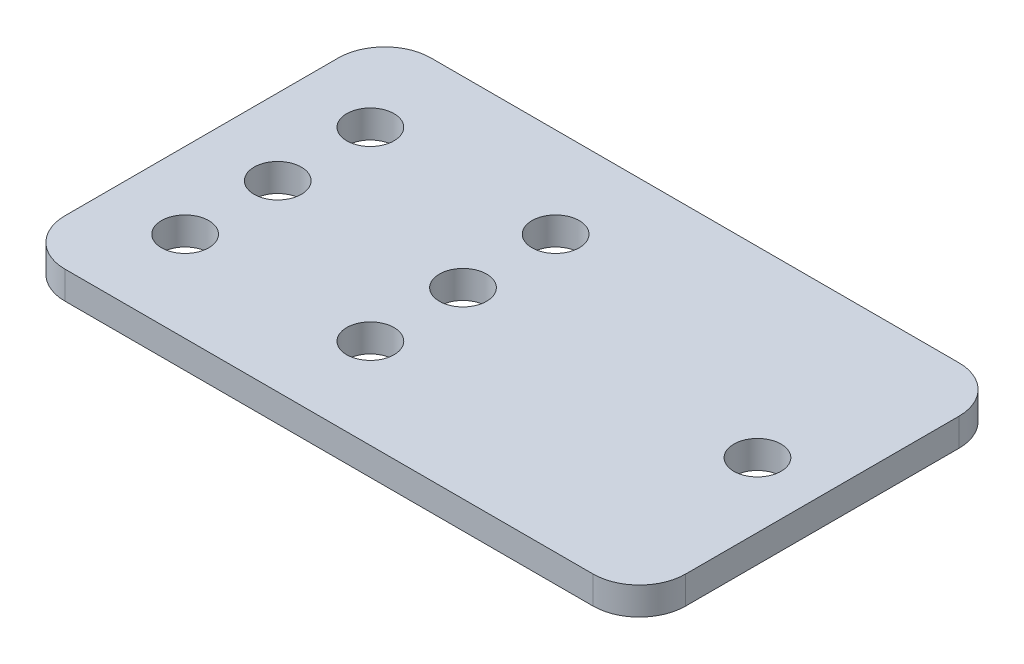
ISO-10303-21;
HEADER;
FILE_DESCRIPTION(('STEP AP214'),'2;1');
FILE_NAME('part.step','',(''),(''),'','','');
FILE_SCHEMA(('AUTOMOTIVE_DESIGN { 1 0 10303 214 1 1 1 1 }'));
ENDSEC;
DATA;
#1=APPLICATION_CONTEXT('core data for automotive mechanical design processes');
#2=APPLICATION_PROTOCOL_DEFINITION('international standard','automotive_design',2000,#1);
#3=PRODUCT_CONTEXT('',#1,'mechanical');
#4=PRODUCT('Part','Part','',(#3));
#5=PRODUCT_RELATED_PRODUCT_CATEGORY('part','',(#4));
#6=PRODUCT_DEFINITION_FORMATION('','',#4);
#7=PRODUCT_DEFINITION_CONTEXT('part definition',#1,'design');
#8=PRODUCT_DEFINITION('design','',#6,#7);
#9=PRODUCT_DEFINITION_SHAPE('','',#8);
#10=(LENGTH_UNIT() NAMED_UNIT(*) SI_UNIT(.MILLI.,.METRE.));
#11=(NAMED_UNIT(*) PLANE_ANGLE_UNIT() SI_UNIT($,.RADIAN.));
#12=(NAMED_UNIT(*) SI_UNIT($,.STERADIAN.) SOLID_ANGLE_UNIT());
#13=UNCERTAINTY_MEASURE_WITH_UNIT(LENGTH_MEASURE(1.E-05),#10,'distance_accuracy_value','');
#14=(GEOMETRIC_REPRESENTATION_CONTEXT(3) GLOBAL_UNCERTAINTY_ASSIGNED_CONTEXT((#13)) GLOBAL_UNIT_ASSIGNED_CONTEXT((#10,
#11,#12)) REPRESENTATION_CONTEXT('',''));
#15=CARTESIAN_POINT('',(0.,0.,0.));
#16=DIRECTION('',(0.,0.,1.));
#17=DIRECTION('',(1.,0.,0.));
#18=AXIS2_PLACEMENT_3D('',#15,#16,#17);
#19=CARTESIAN_POINT('',(-5.,3.,-34.5));
#20=DIRECTION('',(0.,-1.,0.));
#21=DIRECTION('',(0.,0.,-1.));
#22=AXIS2_PLACEMENT_3D('',#19,#20,#21);
#23=PLANE('',#22);
#24=DIRECTION('',(0.,0.,-1.));
#25=VECTOR('',#24,1.);
#26=CARTESIAN_POINT('',(0.,3.,-5.00000000000004));
#27=LINE('',#26,#25);
#28=CARTESIAN_POINT('',(0.,3.,-5.00000000000003));
#29=VERTEX_POINT('',#28);
#30=CARTESIAN_POINT('',(0.,3.,-34.5));
#31=VERTEX_POINT('',#30);
#32=EDGE_CURVE('E283',#29,#31,#27,.T.);
#33=ORIENTED_EDGE('',*,*,#32,.T.);
#34=CARTESIAN_POINT('',(-5.,3.,-34.5));
#35=DIRECTION('',(0.,-1.,0.));
#36=DIRECTION('',(0.,0.,-1.));
#37=AXIS2_PLACEMENT_3D('',#34,#35,#36);
#38=CIRCLE('',#37,5.);
#39=CARTESIAN_POINT('',(-5.00000000000003,3.,-39.5));
#40=VERTEX_POINT('',#39);
#41=EDGE_CURVE('E366',#40,#31,#38,.T.);
#42=ORIENTED_EDGE('',*,*,#41,.F.);
#43=DIRECTION('',(-1.,0.,0.));
#44=VECTOR('',#43,1.);
#45=CARTESIAN_POINT('',(-5.00000000000004,3.,-39.5));
#46=LINE('',#45,#44);
#47=CARTESIAN_POINT('',(-62.,3.,-39.5));
#48=VERTEX_POINT('',#47);
#49=EDGE_CURVE('E356',#40,#48,#46,.T.);
#50=ORIENTED_EDGE('',*,*,#49,.T.);
#51=CARTESIAN_POINT('',(-62.,3.,-34.5));
#52=DIRECTION('',(0.,-1.,0.));
#53=DIRECTION('',(0.,0.,-1.));
#54=AXIS2_PLACEMENT_3D('',#51,#52,#53);
#55=CIRCLE('',#54,5.);
#56=CARTESIAN_POINT('',(-67.,3.,-34.5));
#57=VERTEX_POINT('',#56);
#58=EDGE_CURVE('E374',#57,#48,#55,.T.);
#59=ORIENTED_EDGE('',*,*,#58,.F.);
#60=DIRECTION('',(0.,0.,-1.));
#61=VECTOR('',#60,1.);
#62=CARTESIAN_POINT('',(-67.,3.,-5.00000000000003));
#63=LINE('',#62,#61);
#64=CARTESIAN_POINT('',(-67.,3.,-5.00000000000003));
#65=VERTEX_POINT('',#64);
#66=EDGE_CURVE('E306',#65,#57,#63,.T.);
#67=ORIENTED_EDGE('',*,*,#66,.F.);
#68=CARTESIAN_POINT('',(-62.,3.,-4.99999999999999));
#69=DIRECTION('',(0.,1.,0.));
#70=DIRECTION('',(0.,0.,1.));
#71=AXIS2_PLACEMENT_3D('',#68,#69,#70);
#72=CIRCLE('',#71,5.);
#73=CARTESIAN_POINT('',(-62.,3.,0.));
#74=VERTEX_POINT('',#73);
#75=EDGE_CURVE('E299',#65,#74,#72,.T.);
#76=ORIENTED_EDGE('',*,*,#75,.T.);
#77=DIRECTION('',(-1.,0.,0.));
#78=VECTOR('',#77,1.);
#79=CARTESIAN_POINT('',(-5.00000000000004,3.,0.));
#80=LINE('',#79,#78);
#81=CARTESIAN_POINT('',(-5.00000000000004,3.,0.));
#82=VERTEX_POINT('',#81);
#83=EDGE_CURVE('E303',#82,#74,#80,.T.);
#84=ORIENTED_EDGE('',*,*,#83,.F.);
#85=CARTESIAN_POINT('',(-5.,3.,-5.));
#86=DIRECTION('',(0.,1.,0.));
#87=DIRECTION('',(0.,0.,1.));
#88=AXIS2_PLACEMENT_3D('',#85,#86,#87);
#89=CIRCLE('',#88,5.);
#90=EDGE_CURVE('E247',#82,#29,#89,.T.);
#91=ORIENTED_EDGE('',*,*,#90,.T.);
#92=EDGE_LOOP('',(#33,#42,#50,#59,#67,#76,#84,#91));
#93=FACE_BOUND('',#92,.T.);
#94=CARTESIAN_POINT('',(-38.79,3.,-9.74999999999999));
#95=DIRECTION('',(0.,1.,0.));
#96=DIRECTION('',(0.,0.,1.));
#97=AXIS2_PLACEMENT_3D('',#94,#95,#96);
#98=CIRCLE('',#97,2.55);
#99=CARTESIAN_POINT('',(-38.79,3.,-7.2));
#100=VERTEX_POINT('',#99);
#101=EDGE_CURVE('E329',#100,#100,#98,.T.);
#102=ORIENTED_EDGE('',*,*,#101,.F.);
#103=EDGE_LOOP('',(#102));
#104=FACE_BOUND('',#103,.T.);
#105=CARTESIAN_POINT('',(-38.79,3.,-19.75));
#106=DIRECTION('',(0.,1.,0.));
#107=DIRECTION('',(0.,0.,1.));
#108=AXIS2_PLACEMENT_3D('',#105,#106,#107);
#109=CIRCLE('',#108,2.55);
#110=CARTESIAN_POINT('',(-38.79,3.,-17.2));
#111=VERTEX_POINT('',#110);
#112=EDGE_CURVE('E383',#111,#111,#109,.T.);
#113=ORIENTED_EDGE('',*,*,#112,.F.);
#114=EDGE_LOOP('',(#113));
#115=FACE_BOUND('',#114,.T.);
#116=CARTESIAN_POINT('',(-58.79,3.,-9.74999999999999));
#117=DIRECTION('',(0.,1.,0.));
#118=DIRECTION('',(0.,0.,1.));
#119=AXIS2_PLACEMENT_3D('',#116,#117,#118);
#120=CIRCLE('',#119,2.55);
#121=CARTESIAN_POINT('',(-58.79,3.,-7.2));
#122=VERTEX_POINT('',#121);
#123=EDGE_CURVE('E389',#122,#122,#120,.T.);
#124=ORIENTED_EDGE('',*,*,#123,.F.);
#125=EDGE_LOOP('',(#124));
#126=FACE_BOUND('',#125,.T.);
#127=CARTESIAN_POINT('',(-58.79,3.,-19.75));
#128=DIRECTION('',(0.,1.,0.));
#129=DIRECTION('',(0.,0.,1.));
#130=AXIS2_PLACEMENT_3D('',#127,#128,#129);
#131=CIRCLE('',#130,2.55);
#132=CARTESIAN_POINT('',(-58.79,3.,-17.2));
#133=VERTEX_POINT('',#132);
#134=EDGE_CURVE('E395',#133,#133,#131,.T.);
#135=ORIENTED_EDGE('',*,*,#134,.F.);
#136=EDGE_LOOP('',(#135));
#137=FACE_BOUND('',#136,.T.);
#138=CARTESIAN_POINT('',(-58.79,3.,-29.75));
#139=DIRECTION('',(0.,1.,0.));
#140=DIRECTION('',(0.,0.,1.));
#141=AXIS2_PLACEMENT_3D('',#138,#139,#140);
#142=CIRCLE('',#141,2.55);
#143=CARTESIAN_POINT('',(-58.79,3.,-27.2));
#144=VERTEX_POINT('',#143);
#145=EDGE_CURVE('E401',#144,#144,#142,.T.);
#146=ORIENTED_EDGE('',*,*,#145,.F.);
#147=EDGE_LOOP('',(#146));
#148=FACE_BOUND('',#147,.T.);
#149=CARTESIAN_POINT('',(-38.79,3.,-29.75));
#150=DIRECTION('',(0.,1.,0.));
#151=DIRECTION('',(0.,0.,1.));
#152=AXIS2_PLACEMENT_3D('',#149,#150,#151);
#153=CIRCLE('',#152,2.55);
#154=CARTESIAN_POINT('',(-38.79,3.,-27.2));
#155=VERTEX_POINT('',#154);
#156=EDGE_CURVE('E407',#155,#155,#153,.T.);
#157=ORIENTED_EDGE('',*,*,#156,.F.);
#158=EDGE_LOOP('',(#157));
#159=FACE_BOUND('',#158,.T.);
#160=CARTESIAN_POINT('',(-7.00000000000001,3.,-19.75));
#161=DIRECTION('',(0.,1.,0.));
#162=DIRECTION('',(0.,0.,1.));
#163=AXIS2_PLACEMENT_3D('',#160,#161,#162);
#164=CIRCLE('',#163,2.55);
#165=CARTESIAN_POINT('',(-7.00000000000001,3.,-17.2));
#166=VERTEX_POINT('',#165);
#167=EDGE_CURVE('E413',#166,#166,#164,.T.);
#168=ORIENTED_EDGE('',*,*,#167,.F.);
#169=EDGE_LOOP('',(#168));
#170=FACE_BOUND('',#169,.T.);
#171=ADVANCED_FACE('F230',(#93,#104,#115,#126,#137,#148,#159,#170),#23,.F.);
#172=CARTESIAN_POINT('',(-5.,0.,-34.5));
#173=DIRECTION('',(0.,-1.,0.));
#174=DIRECTION('',(0.,0.,-1.));
#175=AXIS2_PLACEMENT_3D('',#172,#173,#174);
#176=PLANE('',#175);
#177=CARTESIAN_POINT('',(-38.79,0.,-29.75));
#178=DIRECTION('',(0.,1.,0.));
#179=DIRECTION('',(0.,0.,1.));
#180=AXIS2_PLACEMENT_3D('',#177,#178,#179);
#181=CIRCLE('',#180,2.55);
#182=CARTESIAN_POINT('',(-38.79,0.,-27.2));
#183=VERTEX_POINT('',#182);
#184=EDGE_CURVE('E410',#183,#183,#181,.T.);
#185=ORIENTED_EDGE('',*,*,#184,.T.);
#186=EDGE_LOOP('',(#185));
#187=FACE_BOUND('',#186,.T.);
#188=CARTESIAN_POINT('',(-58.79,0.,-19.75));
#189=DIRECTION('',(0.,1.,0.));
#190=DIRECTION('',(0.,0.,1.));
#191=AXIS2_PLACEMENT_3D('',#188,#189,#190);
#192=CIRCLE('',#191,2.55);
#193=CARTESIAN_POINT('',(-58.79,0.,-17.2));
#194=VERTEX_POINT('',#193);
#195=EDGE_CURVE('E398',#194,#194,#192,.T.);
#196=ORIENTED_EDGE('',*,*,#195,.T.);
#197=EDGE_LOOP('',(#196));
#198=FACE_BOUND('',#197,.T.);
#199=CARTESIAN_POINT('',(-38.79,0.,-19.75));
#200=DIRECTION('',(0.,1.,0.));
#201=DIRECTION('',(0.,0.,1.));
#202=AXIS2_PLACEMENT_3D('',#199,#200,#201);
#203=CIRCLE('',#202,2.55);
#204=CARTESIAN_POINT('',(-38.79,0.,-17.2));
#205=VERTEX_POINT('',#204);
#206=EDGE_CURVE('E386',#205,#205,#203,.T.);
#207=ORIENTED_EDGE('',*,*,#206,.T.);
#208=EDGE_LOOP('',(#207));
#209=FACE_BOUND('',#208,.T.);
#210=DIRECTION('',(0.,0.,-1.));
#211=VECTOR('',#210,1.);
#212=CARTESIAN_POINT('',(0.,0.,-5.00000000000004));
#213=LINE('',#212,#211);
#214=CARTESIAN_POINT('',(0.,0.,-5.00000000000003));
#215=VERTEX_POINT('',#214);
#216=CARTESIAN_POINT('',(0.,0.,-34.5));
#217=VERTEX_POINT('',#216);
#218=EDGE_CURVE('E325',#215,#217,#213,.T.);
#219=ORIENTED_EDGE('',*,*,#218,.F.);
#220=CARTESIAN_POINT('',(-5.,0.,-5.));
#221=DIRECTION('',(0.,1.,0.));
#222=DIRECTION('',(0.,0.,1.));
#223=AXIS2_PLACEMENT_3D('',#220,#221,#222);
#224=CIRCLE('',#223,5.);
#225=CARTESIAN_POINT('',(-5.00000000000004,0.,0.));
#226=VERTEX_POINT('',#225);
#227=EDGE_CURVE('E277',#226,#215,#224,.T.);
#228=ORIENTED_EDGE('',*,*,#227,.F.);
#229=DIRECTION('',(-1.,0.,0.));
#230=VECTOR('',#229,1.);
#231=CARTESIAN_POINT('',(-5.00000000000004,0.,0.));
#232=LINE('',#231,#230);
#233=CARTESIAN_POINT('',(-62.,0.,0.));
#234=VERTEX_POINT('',#233);
#235=EDGE_CURVE('E342',#226,#234,#232,.T.);
#236=ORIENTED_EDGE('',*,*,#235,.T.);
#237=CARTESIAN_POINT('',(-62.,0.,-4.99999999999999));
#238=DIRECTION('',(0.,1.,0.));
#239=DIRECTION('',(0.,0.,1.));
#240=AXIS2_PLACEMENT_3D('',#237,#238,#239);
#241=CIRCLE('',#240,5.);
#242=CARTESIAN_POINT('',(-67.,0.,-5.00000000000003));
#243=VERTEX_POINT('',#242);
#244=EDGE_CURVE('E313',#243,#234,#241,.T.);
#245=ORIENTED_EDGE('',*,*,#244,.F.);
#246=DIRECTION('',(0.,0.,-1.));
#247=VECTOR('',#246,1.);
#248=CARTESIAN_POINT('',(-67.,0.,-5.00000000000003));
#249=LINE('',#248,#247);
#250=CARTESIAN_POINT('',(-67.,0.,-34.5));
#251=VERTEX_POINT('',#250);
#252=EDGE_CURVE('E338',#243,#251,#249,.T.);
#253=ORIENTED_EDGE('',*,*,#252,.T.);
#254=CARTESIAN_POINT('',(-62.,0.,-34.5));
#255=DIRECTION('',(0.,-1.,0.));
#256=DIRECTION('',(0.,0.,-1.));
#257=AXIS2_PLACEMENT_3D('',#254,#255,#256);
#258=CIRCLE('',#257,5.);
#259=CARTESIAN_POINT('',(-62.,0.,-39.5));
#260=VERTEX_POINT('',#259);
#261=EDGE_CURVE('E335',#251,#260,#258,.T.);
#262=ORIENTED_EDGE('',*,*,#261,.T.);
#263=DIRECTION('',(-1.,0.,0.));
#264=VECTOR('',#263,1.);
#265=CARTESIAN_POINT('',(-5.00000000000004,0.,-39.5));
#266=LINE('',#265,#264);
#267=CARTESIAN_POINT('',(-5.00000000000003,0.,-39.5));
#268=VERTEX_POINT('',#267);
#269=EDGE_CURVE('E332',#268,#260,#266,.T.);
#270=ORIENTED_EDGE('',*,*,#269,.F.);
#271=CARTESIAN_POINT('',(-5.,0.,-34.5));
#272=DIRECTION('',(0.,-1.,0.));
#273=DIRECTION('',(0.,0.,-1.));
#274=AXIS2_PLACEMENT_3D('',#271,#272,#273);
#275=CIRCLE('',#274,5.);
#276=EDGE_CURVE('E328',#268,#217,#275,.T.);
#277=ORIENTED_EDGE('',*,*,#276,.T.);
#278=EDGE_LOOP('',(#219,#228,#236,#245,#253,#262,#270,#277));
#279=FACE_BOUND('',#278,.T.);
#280=CARTESIAN_POINT('',(-38.79,0.,-9.74999999999999));
#281=DIRECTION('',(0.,1.,0.));
#282=DIRECTION('',(0.,0.,1.));
#283=AXIS2_PLACEMENT_3D('',#280,#281,#282);
#284=CIRCLE('',#283,2.55);
#285=CARTESIAN_POINT('',(-38.79,0.,-7.2));
#286=VERTEX_POINT('',#285);
#287=EDGE_CURVE('E380',#286,#286,#284,.T.);
#288=ORIENTED_EDGE('',*,*,#287,.T.);
#289=EDGE_LOOP('',(#288));
#290=FACE_BOUND('',#289,.T.);
#291=CARTESIAN_POINT('',(-58.79,0.,-9.74999999999999));
#292=DIRECTION('',(0.,1.,0.));
#293=DIRECTION('',(0.,0.,1.));
#294=AXIS2_PLACEMENT_3D('',#291,#292,#293);
#295=CIRCLE('',#294,2.55);
#296=CARTESIAN_POINT('',(-58.79,0.,-7.2));
#297=VERTEX_POINT('',#296);
#298=EDGE_CURVE('E392',#297,#297,#295,.T.);
#299=ORIENTED_EDGE('',*,*,#298,.T.);
#300=EDGE_LOOP('',(#299));
#301=FACE_BOUND('',#300,.T.);
#302=CARTESIAN_POINT('',(-58.79,0.,-29.75));
#303=DIRECTION('',(0.,1.,0.));
#304=DIRECTION('',(0.,0.,1.));
#305=AXIS2_PLACEMENT_3D('',#302,#303,#304);
#306=CIRCLE('',#305,2.55);
#307=CARTESIAN_POINT('',(-58.79,0.,-27.2));
#308=VERTEX_POINT('',#307);
#309=EDGE_CURVE('E404',#308,#308,#306,.T.);
#310=ORIENTED_EDGE('',*,*,#309,.T.);
#311=EDGE_LOOP('',(#310));
#312=FACE_BOUND('',#311,.T.);
#313=CARTESIAN_POINT('',(-7.00000000000001,0.,-19.75));
#314=DIRECTION('',(0.,1.,0.));
#315=DIRECTION('',(0.,0.,1.));
#316=AXIS2_PLACEMENT_3D('',#313,#314,#315);
#317=CIRCLE('',#316,2.55);
#318=CARTESIAN_POINT('',(-7.00000000000001,0.,-17.2));
#319=VERTEX_POINT('',#318);
#320=EDGE_CURVE('E416',#319,#319,#317,.T.);
#321=ORIENTED_EDGE('',*,*,#320,.T.);
#322=EDGE_LOOP('',(#321));
#323=FACE_BOUND('',#322,.T.);
#324=ADVANCED_FACE('F362',(#187,#198,#209,#279,#290,#301,#312,#323),#176,.T.);
#325=CARTESIAN_POINT('',(0.,3.,-5.00000000000004));
#326=DIRECTION('',(-1.,0.,0.));
#327=DIRECTION('',(0.,0.,1.));
#328=AXIS2_PLACEMENT_3D('',#325,#326,#327);
#329=PLANE('',#328);
#330=ORIENTED_EDGE('',*,*,#218,.T.);
#331=DIRECTION('',(0.,-1.,0.));
#332=VECTOR('',#331,1.);
#333=CARTESIAN_POINT('',(0.,3.,-34.5));
#334=LINE('',#333,#332);
#335=EDGE_CURVE('E12',#31,#217,#334,.T.);
#336=ORIENTED_EDGE('',*,*,#335,.F.);
#337=ORIENTED_EDGE('',*,*,#32,.F.);
#338=DIRECTION('',(0.,-1.,0.));
#339=VECTOR('',#338,1.);
#340=CARTESIAN_POINT('',(0.,3.,-5.00000000000003));
#341=LINE('',#340,#339);
#342=EDGE_CURVE('E321',#29,#215,#341,.T.);
#343=ORIENTED_EDGE('',*,*,#342,.T.);
#344=EDGE_LOOP('',(#330,#336,#337,#343));
#345=FACE_BOUND('',#344,.T.);
#346=ADVANCED_FACE('F232',(#345),#329,.F.);
#347=CARTESIAN_POINT('',(-5.,3.,-34.5));
#348=DIRECTION('',(0.,-1.,0.));
#349=DIRECTION('',(0.,0.,-1.));
#350=AXIS2_PLACEMENT_3D('',#347,#348,#349);
#351=CYLINDRICAL_SURFACE('',#350,5.);
#352=ORIENTED_EDGE('',*,*,#276,.F.);
#353=DIRECTION('',(0.,-1.,0.));
#354=VECTOR('',#353,1.);
#355=CARTESIAN_POINT('',(-5.00000000000003,3.,-39.5));
#356=LINE('',#355,#354);
#357=EDGE_CURVE('E239',#40,#268,#356,.T.);
#358=ORIENTED_EDGE('',*,*,#357,.F.);
#359=ORIENTED_EDGE('',*,*,#41,.T.);
#360=ORIENTED_EDGE('',*,*,#335,.T.);
#361=EDGE_LOOP('',(#352,#358,#359,#360));
#362=FACE_BOUND('',#361,.T.);
#363=ADVANCED_FACE('F365',(#362),#351,.T.);
#364=CARTESIAN_POINT('',(-5.00000000000004,3.,-39.5));
#365=DIRECTION('',(0.,0.,1.));
#366=DIRECTION('',(1.,0.,0.));
#367=AXIS2_PLACEMENT_3D('',#364,#365,#366);
#368=PLANE('',#367);
#369=ORIENTED_EDGE('',*,*,#269,.T.);
#370=DIRECTION('',(0.,-1.,0.));
#371=VECTOR('',#370,1.);
#372=CARTESIAN_POINT('',(-62.,3.,-39.5));
#373=LINE('',#372,#371);
#374=EDGE_CURVE('E350',#48,#260,#373,.T.);
#375=ORIENTED_EDGE('',*,*,#374,.F.);
#376=ORIENTED_EDGE('',*,*,#49,.F.);
#377=ORIENTED_EDGE('',*,*,#357,.T.);
#378=EDGE_LOOP('',(#369,#375,#376,#377));
#379=FACE_BOUND('',#378,.T.);
#380=ADVANCED_FACE('F354',(#379),#368,.F.);
#381=CARTESIAN_POINT('',(-62.,3.,-34.5));
#382=DIRECTION('',(0.,-1.,0.));
#383=DIRECTION('',(0.,0.,-1.));
#384=AXIS2_PLACEMENT_3D('',#381,#382,#383);
#385=CYLINDRICAL_SURFACE('',#384,5.);
#386=ORIENTED_EDGE('',*,*,#261,.F.);
#387=DIRECTION('',(0.,-1.,0.));
#388=VECTOR('',#387,1.);
#389=CARTESIAN_POINT('',(-67.,3.,-34.5));
#390=LINE('',#389,#388);
#391=EDGE_CURVE('E348',#57,#251,#390,.T.);
#392=ORIENTED_EDGE('',*,*,#391,.F.);
#393=ORIENTED_EDGE('',*,*,#58,.T.);
#394=ORIENTED_EDGE('',*,*,#374,.T.);
#395=EDGE_LOOP('',(#386,#392,#393,#394));
#396=FACE_BOUND('',#395,.T.);
#397=ADVANCED_FACE('F373',(#396),#385,.T.);
#398=CARTESIAN_POINT('',(-67.,3.,-5.00000000000003));
#399=DIRECTION('',(-1.,0.,0.));
#400=DIRECTION('',(0.,0.,1.));
#401=AXIS2_PLACEMENT_3D('',#398,#399,#400);
#402=PLANE('',#401);
#403=ORIENTED_EDGE('',*,*,#252,.F.);
#404=DIRECTION('',(0.,-1.,0.));
#405=VECTOR('',#404,1.);
#406=CARTESIAN_POINT('',(-67.,3.,-5.00000000000003));
#407=LINE('',#406,#405);
#408=EDGE_CURVE('E317',#65,#243,#407,.T.);
#409=ORIENTED_EDGE('',*,*,#408,.F.);
#410=ORIENTED_EDGE('',*,*,#66,.T.);
#411=ORIENTED_EDGE('',*,*,#391,.T.);
#412=EDGE_LOOP('',(#403,#409,#410,#411));
#413=FACE_BOUND('',#412,.T.);
#414=ADVANCED_FACE('F370',(#413),#402,.T.);
#415=CARTESIAN_POINT('',(-62.,3.,-4.99999999999999));
#416=DIRECTION('',(0.,-1.,0.));
#417=DIRECTION('',(0.,0.,-1.));
#418=AXIS2_PLACEMENT_3D('',#415,#416,#417);
#419=CYLINDRICAL_SURFACE('',#418,5.);
#420=ORIENTED_EDGE('',*,*,#244,.T.);
#421=DIRECTION('',(0.,-1.,0.));
#422=VECTOR('',#421,1.);
#423=CARTESIAN_POINT('',(-62.,3.,0.));
#424=LINE('',#423,#422);
#425=EDGE_CURVE('E310',#74,#234,#424,.T.);
#426=ORIENTED_EDGE('',*,*,#425,.F.);
#427=ORIENTED_EDGE('',*,*,#75,.F.);
#428=ORIENTED_EDGE('',*,*,#408,.T.);
#429=EDGE_LOOP('',(#420,#426,#427,#428));
#430=FACE_BOUND('',#429,.T.);
#431=ADVANCED_FACE('F311',(#430),#419,.T.);
#432=CARTESIAN_POINT('',(-5.00000000000004,3.,0.));
#433=DIRECTION('',(0.,0.,1.));
#434=DIRECTION('',(1.,0.,0.));
#435=AXIS2_PLACEMENT_3D('',#432,#433,#434);
#436=PLANE('',#435);
#437=ORIENTED_EDGE('',*,*,#235,.F.);
#438=DIRECTION('',(0.,-1.,0.));
#439=VECTOR('',#438,1.);
#440=CARTESIAN_POINT('',(-5.00000000000004,3.,0.));
#441=LINE('',#440,#439);
#442=EDGE_CURVE('E274',#82,#226,#441,.T.);
#443=ORIENTED_EDGE('',*,*,#442,.F.);
#444=ORIENTED_EDGE('',*,*,#83,.T.);
#445=ORIENTED_EDGE('',*,*,#425,.T.);
#446=EDGE_LOOP('',(#437,#443,#444,#445));
#447=FACE_BOUND('',#446,.T.);
#448=ADVANCED_FACE('F319',(#447),#436,.T.);
#449=CARTESIAN_POINT('',(-5.,3.,-5.));
#450=DIRECTION('',(0.,-1.,0.));
#451=DIRECTION('',(0.,0.,-1.));
#452=AXIS2_PLACEMENT_3D('',#449,#450,#451);
#453=CYLINDRICAL_SURFACE('',#452,5.);
#454=ORIENTED_EDGE('',*,*,#227,.T.);
#455=ORIENTED_EDGE('',*,*,#342,.F.);
#456=ORIENTED_EDGE('',*,*,#90,.F.);
#457=ORIENTED_EDGE('',*,*,#442,.T.);
#458=EDGE_LOOP('',(#454,#455,#456,#457));
#459=FACE_BOUND('',#458,.T.);
#460=ADVANCED_FACE('F436',(#459),#453,.T.);
#461=CARTESIAN_POINT('',(-38.79,3.,-9.74999999999999));
#462=DIRECTION('',(0.,-1.,0.));
#463=DIRECTION('',(0.,0.,-1.));
#464=AXIS2_PLACEMENT_3D('',#461,#462,#463);
#465=CYLINDRICAL_SURFACE('',#464,2.55);
#466=ORIENTED_EDGE('',*,*,#101,.T.);
#467=EDGE_LOOP('',(#466));
#468=FACE_BOUND('',#467,.T.);
#469=ORIENTED_EDGE('',*,*,#287,.F.);
#470=EDGE_LOOP('',(#469));
#471=FACE_BOUND('',#470,.T.);
#472=ADVANCED_FACE('F433',(#468,#471),#465,.F.);
#473=CARTESIAN_POINT('',(-38.79,3.,-19.75));
#474=DIRECTION('',(0.,-1.,0.));
#475=DIRECTION('',(0.,0.,-1.));
#476=AXIS2_PLACEMENT_3D('',#473,#474,#475);
#477=CYLINDRICAL_SURFACE('',#476,2.55);
#478=ORIENTED_EDGE('',*,*,#112,.T.);
#479=EDGE_LOOP('',(#478));
#480=FACE_BOUND('',#479,.T.);
#481=ORIENTED_EDGE('',*,*,#206,.F.);
#482=EDGE_LOOP('',(#481));
#483=FACE_BOUND('',#482,.T.);
#484=ADVANCED_FACE('F519',(#480,#483),#477,.F.);
#485=CARTESIAN_POINT('',(-58.79,3.,-9.74999999999999));
#486=DIRECTION('',(0.,-1.,0.));
#487=DIRECTION('',(0.,0.,-1.));
#488=AXIS2_PLACEMENT_3D('',#485,#486,#487);
#489=CYLINDRICAL_SURFACE('',#488,2.55);
#490=ORIENTED_EDGE('',*,*,#123,.T.);
#491=EDGE_LOOP('',(#490));
#492=FACE_BOUND('',#491,.T.);
#493=ORIENTED_EDGE('',*,*,#298,.F.);
#494=EDGE_LOOP('',(#493));
#495=FACE_BOUND('',#494,.T.);
#496=ADVANCED_FACE('F527',(#492,#495),#489,.F.);
#497=CARTESIAN_POINT('',(-58.79,3.,-19.75));
#498=DIRECTION('',(0.,-1.,0.));
#499=DIRECTION('',(0.,0.,-1.));
#500=AXIS2_PLACEMENT_3D('',#497,#498,#499);
#501=CYLINDRICAL_SURFACE('',#500,2.55);
#502=ORIENTED_EDGE('',*,*,#134,.T.);
#503=EDGE_LOOP('',(#502));
#504=FACE_BOUND('',#503,.T.);
#505=ORIENTED_EDGE('',*,*,#195,.F.);
#506=EDGE_LOOP('',(#505));
#507=FACE_BOUND('',#506,.T.);
#508=ADVANCED_FACE('F535',(#504,#507),#501,.F.);
#509=CARTESIAN_POINT('',(-58.79,3.,-29.75));
#510=DIRECTION('',(0.,-1.,0.));
#511=DIRECTION('',(0.,0.,-1.));
#512=AXIS2_PLACEMENT_3D('',#509,#510,#511);
#513=CYLINDRICAL_SURFACE('',#512,2.55);
#514=ORIENTED_EDGE('',*,*,#145,.T.);
#515=EDGE_LOOP('',(#514));
#516=FACE_BOUND('',#515,.T.);
#517=ORIENTED_EDGE('',*,*,#309,.F.);
#518=EDGE_LOOP('',(#517));
#519=FACE_BOUND('',#518,.T.);
#520=ADVANCED_FACE('F544',(#516,#519),#513,.F.);
#521=CARTESIAN_POINT('',(-38.79,3.,-29.75));
#522=DIRECTION('',(0.,-1.,0.));
#523=DIRECTION('',(0.,0.,-1.));
#524=AXIS2_PLACEMENT_3D('',#521,#522,#523);
#525=CYLINDRICAL_SURFACE('',#524,2.55);
#526=ORIENTED_EDGE('',*,*,#156,.T.);
#527=EDGE_LOOP('',(#526));
#528=FACE_BOUND('',#527,.T.);
#529=ORIENTED_EDGE('',*,*,#184,.F.);
#530=EDGE_LOOP('',(#529));
#531=FACE_BOUND('',#530,.T.);
#532=ADVANCED_FACE('F553',(#528,#531),#525,.F.);
#533=CARTESIAN_POINT('',(-7.00000000000001,3.,-19.75));
#534=DIRECTION('',(0.,-1.,0.));
#535=DIRECTION('',(0.,0.,-1.));
#536=AXIS2_PLACEMENT_3D('',#533,#534,#535);
#537=CYLINDRICAL_SURFACE('',#536,2.55);
#538=ORIENTED_EDGE('',*,*,#167,.T.);
#539=EDGE_LOOP('',(#538));
#540=FACE_BOUND('',#539,.T.);
#541=ORIENTED_EDGE('',*,*,#320,.F.);
#542=EDGE_LOOP('',(#541));
#543=FACE_BOUND('',#542,.T.);
#544=ADVANCED_FACE('F422',(#540,#543),#537,.F.);
#545=CLOSED_SHELL('',(#171,#324,#346,#363,#380,#397,#414,#431,#448,#460,#472,#484,#496,#508,
#520,#532,#544));
#546=MANIFOLD_SOLID_BREP('B2',#545);
#547=ADVANCED_BREP_SHAPE_REPRESENTATION('',(#18,#546),#14);
#548=SHAPE_DEFINITION_REPRESENTATION(#9,#547);
ENDSEC;
END-ISO-10303-21;
